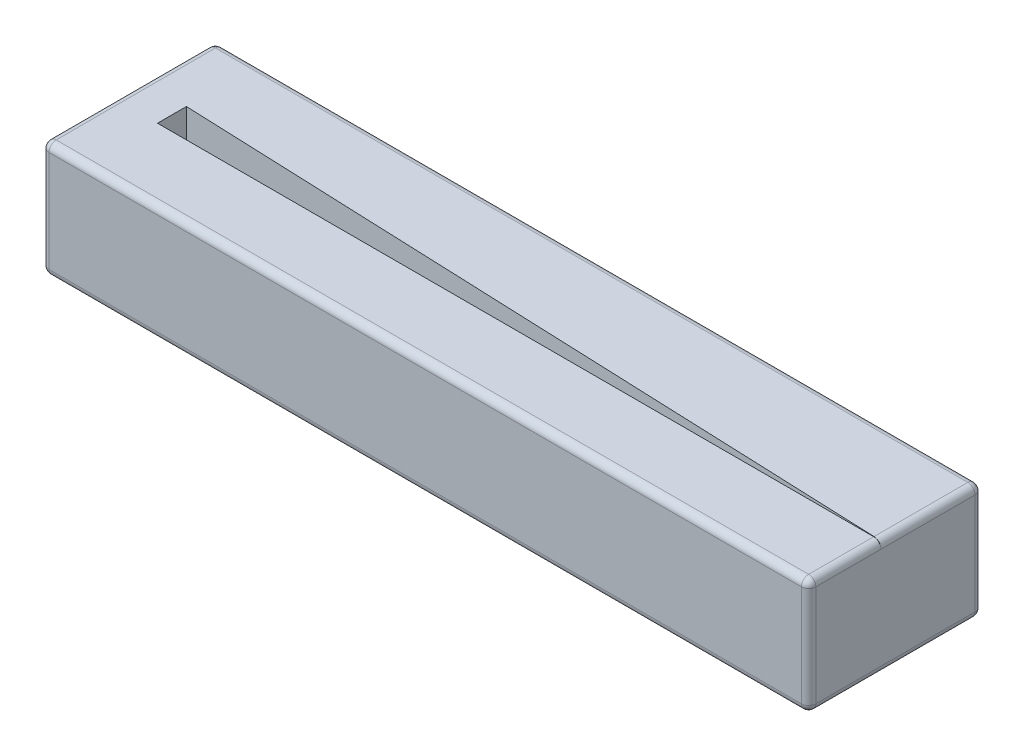
ISO-10303-21;
HEADER;
FILE_DESCRIPTION(('STEP AP214'),'2;1');
FILE_NAME('part.step','',(''),(''),'','','');
FILE_SCHEMA(('AUTOMOTIVE_DESIGN { 1 0 10303 214 1 1 1 1 }'));
ENDSEC;
DATA;
#1=APPLICATION_CONTEXT('core data for automotive mechanical design processes');
#2=APPLICATION_PROTOCOL_DEFINITION('international standard','automotive_design',2000,#1);
#3=PRODUCT_CONTEXT('',#1,'mechanical');
#4=PRODUCT('Part','Part','',(#3));
#5=PRODUCT_RELATED_PRODUCT_CATEGORY('part','',(#4));
#6=PRODUCT_DEFINITION_FORMATION('','',#4);
#7=PRODUCT_DEFINITION_CONTEXT('part definition',#1,'design');
#8=PRODUCT_DEFINITION('design','',#6,#7);
#9=PRODUCT_DEFINITION_SHAPE('','',#8);
#10=(LENGTH_UNIT() NAMED_UNIT(*) SI_UNIT(.MILLI.,.METRE.));
#11=(NAMED_UNIT(*) PLANE_ANGLE_UNIT() SI_UNIT($,.RADIAN.));
#12=(NAMED_UNIT(*) SI_UNIT($,.STERADIAN.) SOLID_ANGLE_UNIT());
#13=UNCERTAINTY_MEASURE_WITH_UNIT(LENGTH_MEASURE(1.E-05),#10,'distance_accuracy_value','');
#14=(GEOMETRIC_REPRESENTATION_CONTEXT(3) GLOBAL_UNCERTAINTY_ASSIGNED_CONTEXT((#13)) GLOBAL_UNIT_ASSIGNED_CONTEXT((#10,
#11,#12)) REPRESENTATION_CONTEXT('',''));
#15=CARTESIAN_POINT('',(0.,0.,0.));
#16=DIRECTION('',(0.,0.,1.));
#17=DIRECTION('',(1.,0.,0.));
#18=AXIS2_PLACEMENT_3D('',#15,#16,#17);
#19=CARTESIAN_POINT('',(0.,5.,6.));
#20=DIRECTION('',(1.,0.,0.));
#21=DIRECTION('',(0.,0.,-1.));
#22=AXIS2_PLACEMENT_3D('',#19,#20,#21);
#23=PLANE('',#22);
#24=DIRECTION('',(0.,-1.,0.));
#25=VECTOR('',#24,1.);
#26=CARTESIAN_POINT('',(0.,5.,0.999999999999997));
#27=LINE('',#26,#25);
#28=CARTESIAN_POINT('',(0.,5.,0.999999999999997));
#29=VERTEX_POINT('',#28);
#30=CARTESIAN_POINT('',(0.,0.,0.999999999999997));
#31=VERTEX_POINT('',#30);
#32=EDGE_CURVE('E199',#29,#31,#27,.T.);
#33=ORIENTED_EDGE('',*,*,#32,.T.);
#34=DIRECTION('',(0.,0.,-1.));
#35=VECTOR('',#34,1.);
#36=CARTESIAN_POINT('',(0.,0.,6.));
#37=LINE('',#36,#35);
#38=CARTESIAN_POINT('',(0.,0.,-1.));
#39=VERTEX_POINT('',#38);
#40=EDGE_CURVE('E187',#31,#39,#37,.T.);
#41=ORIENTED_EDGE('',*,*,#40,.T.);
#42=DIRECTION('',(0.,-1.,0.));
#43=VECTOR('',#42,1.);
#44=CARTESIAN_POINT('',(0.,5.,-1.));
#45=LINE('',#44,#43);
#46=CARTESIAN_POINT('',(0.,5.,-1.));
#47=VERTEX_POINT('',#46);
#48=EDGE_CURVE('E173',#47,#39,#45,.T.);
#49=ORIENTED_EDGE('',*,*,#48,.F.);
#50=DIRECTION('',(0.,0.,1.));
#51=VECTOR('',#50,1.);
#52=CARTESIAN_POINT('',(0.,5.,6.));
#53=LINE('',#52,#51);
#54=EDGE_CURVE('E194',#47,#29,#53,.T.);
#55=ORIENTED_EDGE('',*,*,#54,.T.);
#56=EDGE_LOOP('',(#33,#41,#49,#55));
#57=FACE_BOUND('',#56,.T.);
#58=ADVANCED_FACE('F43',(#57),#23,.T.);
#59=CARTESIAN_POINT('',(50.,5.,0.));
#60=DIRECTION('',(1.,0.,0.));
#61=DIRECTION('',(0.,0.,-1.));
#62=AXIS2_PLACEMENT_3D('',#59,#60,#61);
#63=PLANE('',#62);
#64=DIRECTION('',(0.,-1.,0.));
#65=VECTOR('',#64,1.);
#66=CARTESIAN_POINT('',(50.,5.,0.999999999999997));
#67=LINE('',#66,#65);
#68=CARTESIAN_POINT('',(50.,4.5,0.999999999999997));
#69=VERTEX_POINT('',#68);
#70=CARTESIAN_POINT('',(50.,0.,0.999999999999997));
#71=VERTEX_POINT('',#70);
#72=EDGE_CURVE('E203',#69,#71,#67,.T.);
#73=ORIENTED_EDGE('',*,*,#72,.F.);
#74=DIRECTION('',(0.,0.,1.));
#75=VECTOR('',#74,1.);
#76=CARTESIAN_POINT('',(50.,4.5,0.));
#77=LINE('',#76,#75);
#78=CARTESIAN_POINT('',(50.,4.5,5.5));
#79=VERTEX_POINT('',#78);
#80=EDGE_CURVE('E241',#69,#79,#77,.T.);
#81=ORIENTED_EDGE('',*,*,#80,.T.);
#82=DIRECTION('',(0.,-1.,0.));
#83=VECTOR('',#82,1.);
#84=CARTESIAN_POINT('',(50.,-3.,5.5));
#85=LINE('',#84,#83);
#86=CARTESIAN_POINT('',(50.,-2.5,5.5));
#87=VERTEX_POINT('',#86);
#88=EDGE_CURVE('E239',#79,#87,#85,.T.);
#89=ORIENTED_EDGE('',*,*,#88,.T.);
#90=DIRECTION('',(0.,0.,1.));
#91=VECTOR('',#90,1.);
#92=CARTESIAN_POINT('',(50.,-2.5,-6.));
#93=LINE('',#92,#91);
#94=CARTESIAN_POINT('',(50.,-2.5,-5.5));
#95=VERTEX_POINT('',#94);
#96=EDGE_CURVE('E237',#87,#95,#93,.F.);
#97=ORIENTED_EDGE('',*,*,#96,.T.);
#98=DIRECTION('',(0.,-1.,0.));
#99=VECTOR('',#98,1.);
#100=CARTESIAN_POINT('',(50.,5.,-5.5));
#101=LINE('',#100,#99);
#102=CARTESIAN_POINT('',(50.,4.5,-5.5));
#103=VERTEX_POINT('',#102);
#104=EDGE_CURVE('E235',#95,#103,#101,.F.);
#105=ORIENTED_EDGE('',*,*,#104,.T.);
#106=DIRECTION('',(0.,0.,1.));
#107=VECTOR('',#106,1.);
#108=CARTESIAN_POINT('',(50.,4.5,0.));
#109=LINE('',#108,#107);
#110=CARTESIAN_POINT('',(50.,4.5,0.998001998001992));
#111=VERTEX_POINT('',#110);
#112=EDGE_CURVE('E170',#103,#111,#109,.T.);
#113=ORIENTED_EDGE('',*,*,#112,.T.);
#114=DIRECTION('',(0.,-1.,0.));
#115=VECTOR('',#114,1.);
#116=CARTESIAN_POINT('',(50.,5.,0.998001998001992));
#117=LINE('',#116,#115);
#118=CARTESIAN_POINT('',(50.,0.,0.998001998001992));
#119=VERTEX_POINT('',#118);
#120=EDGE_CURVE('E163',#111,#119,#117,.T.);
#121=ORIENTED_EDGE('',*,*,#120,.T.);
#122=DIRECTION('',(0.,0.,1.));
#123=VECTOR('',#122,1.);
#124=CARTESIAN_POINT('',(50.,0.,6.));
#125=LINE('',#124,#123);
#126=EDGE_CURVE('E168',#119,#71,#125,.T.);
#127=ORIENTED_EDGE('',*,*,#126,.T.);
#128=EDGE_LOOP('',(#73,#81,#89,#97,#105,#113,#121,#127));
#129=FACE_BOUND('',#128,.T.);
#130=ADVANCED_FACE('F166',(#129),#63,.T.);
#131=CARTESIAN_POINT('',(0.,5.,1.));
#132=DIRECTION('',(0.,0.,1.));
#133=DIRECTION('',(1.,0.,0.));
#134=AXIS2_PLACEMENT_3D('',#131,#132,#133);
#135=PLANE('',#134);
#136=DIRECTION('',(-1.,0.,0.));
#137=VECTOR('',#136,1.);
#138=CARTESIAN_POINT('',(0.,5.,1.));
#139=LINE('',#138,#137);
#140=CARTESIAN_POINT('',(49.5,5.,0.999999999999994));
#141=VERTEX_POINT('',#140);
#142=EDGE_CURVE('E197',#141,#29,#139,.T.);
#143=ORIENTED_EDGE('',*,*,#142,.F.);
#144=CARTESIAN_POINT('',(49.5,4.5,0.999999999999994));
#145=DIRECTION('',(0.,0.,1.));
#146=DIRECTION('',(1.,0.,0.));
#147=AXIS2_PLACEMENT_3D('',#144,#145,#146);
#148=CIRCLE('',#147,0.5);
#149=EDGE_CURVE('E52',#141,#69,#148,.F.);
#150=ORIENTED_EDGE('',*,*,#149,.T.);
#151=ORIENTED_EDGE('',*,*,#72,.T.);
#152=DIRECTION('',(-1.,0.,0.));
#153=VECTOR('',#152,1.);
#154=CARTESIAN_POINT('',(0.,0.,1.));
#155=LINE('',#154,#153);
#156=EDGE_CURVE('E186',#71,#31,#155,.T.);
#157=ORIENTED_EDGE('',*,*,#156,.T.);
#158=ORIENTED_EDGE('',*,*,#32,.F.);
#159=EDGE_LOOP('',(#143,#150,#151,#157,#158));
#160=FACE_BOUND('',#159,.T.);
#161=ADVANCED_FACE('F366',(#160),#135,.F.);
#162=CARTESIAN_POINT('',(0.,5.,6.));
#163=DIRECTION('',(0.,0.,-1.));
#164=DIRECTION('',(-1.,0.,0.));
#165=AXIS2_PLACEMENT_3D('',#162,#163,#164);
#166=PLANE('',#165);
#167=DIRECTION('',(1.,0.,0.));
#168=VECTOR('',#167,1.);
#169=CARTESIAN_POINT('',(-3.,4.5,6.));
#170=LINE('',#169,#168);
#171=CARTESIAN_POINT('',(49.5,4.5,6.));
#172=VERTEX_POINT('',#171);
#173=CARTESIAN_POINT('',(-2.5,4.5,6.));
#174=VERTEX_POINT('',#173);
#175=EDGE_CURVE('E60',#172,#174,#170,.F.);
#176=ORIENTED_EDGE('',*,*,#175,.T.);
#177=DIRECTION('',(0.,-1.,0.));
#178=VECTOR('',#177,1.);
#179=CARTESIAN_POINT('',(-2.5,-3.,6.));
#180=LINE('',#179,#178);
#181=CARTESIAN_POINT('',(-2.5,-2.5,6.));
#182=VERTEX_POINT('',#181);
#183=EDGE_CURVE('E256',#174,#182,#180,.T.);
#184=ORIENTED_EDGE('',*,*,#183,.T.);
#185=DIRECTION('',(-1.,0.,0.));
#186=VECTOR('',#185,1.);
#187=CARTESIAN_POINT('',(0.,-2.5,6.));
#188=LINE('',#187,#186);
#189=CARTESIAN_POINT('',(49.5,-2.5,6.));
#190=VERTEX_POINT('',#189);
#191=EDGE_CURVE('E252',#182,#190,#188,.F.);
#192=ORIENTED_EDGE('',*,*,#191,.T.);
#193=DIRECTION('',(0.,-1.,0.));
#194=VECTOR('',#193,1.);
#195=CARTESIAN_POINT('',(49.5,5.,6.));
#196=LINE('',#195,#194);
#197=EDGE_CURVE('E65',#190,#172,#196,.F.);
#198=ORIENTED_EDGE('',*,*,#197,.T.);
#199=EDGE_LOOP('',(#176,#184,#192,#198));
#200=FACE_BOUND('',#199,.T.);
#201=ADVANCED_FACE('F342',(#200),#166,.F.);
#202=CARTESIAN_POINT('',(0.,5.,0.));
#203=DIRECTION('',(0.,1.,0.));
#204=DIRECTION('',(0.,0.,1.));
#205=AXIS2_PLACEMENT_3D('',#202,#203,#204);
#206=PLANE('',#205);
#207=DIRECTION('',(1.,0.,0.));
#208=VECTOR('',#207,1.);
#209=CARTESIAN_POINT('',(50.,5.,5.5));
#210=LINE('',#209,#208);
#211=CARTESIAN_POINT('',(-2.5,5.,5.5));
#212=VERTEX_POINT('',#211);
#213=CARTESIAN_POINT('',(49.5,5.,5.5));
#214=VERTEX_POINT('',#213);
#215=EDGE_CURVE('E216',#212,#214,#210,.T.);
#216=ORIENTED_EDGE('',*,*,#215,.T.);
#217=DIRECTION('',(0.,0.,1.));
#218=VECTOR('',#217,1.);
#219=CARTESIAN_POINT('',(49.5,5.,0.));
#220=LINE('',#219,#218);
#221=EDGE_CURVE('E223',#214,#141,#220,.F.);
#222=ORIENTED_EDGE('',*,*,#221,.T.);
#223=ORIENTED_EDGE('',*,*,#142,.T.);
#224=ORIENTED_EDGE('',*,*,#54,.F.);
#225=DIRECTION('',(0.999202552502205,0.,0.0399281739261619));
#226=VECTOR('',#225,1.);
#227=CARTESIAN_POINT('',(0.039896333303773,5.,-0.998405740926922));
#228=LINE('',#227,#226);
#229=CARTESIAN_POINT('',(49.5,5.,0.978021978021972));
#230=VERTEX_POINT('',#229);
#231=EDGE_CURVE('E174',#47,#230,#228,.T.);
#232=ORIENTED_EDGE('',*,*,#231,.T.);
#233=DIRECTION('',(0.,0.,1.));
#234=VECTOR('',#233,1.);
#235=CARTESIAN_POINT('',(49.5,5.,0.));
#236=LINE('',#235,#234);
#237=CARTESIAN_POINT('',(49.5,5.,-5.5));
#238=VERTEX_POINT('',#237);
#239=EDGE_CURVE('E221',#230,#238,#236,.F.);
#240=ORIENTED_EDGE('',*,*,#239,.T.);
#241=DIRECTION('',(1.,0.,0.));
#242=VECTOR('',#241,1.);
#243=CARTESIAN_POINT('',(0.,5.,-5.5));
#244=LINE('',#243,#242);
#245=CARTESIAN_POINT('',(-2.5,5.,-5.5));
#246=VERTEX_POINT('',#245);
#247=EDGE_CURVE('E218',#238,#246,#244,.F.);
#248=ORIENTED_EDGE('',*,*,#247,.T.);
#249=DIRECTION('',(0.,0.,-1.));
#250=VECTOR('',#249,1.);
#251=CARTESIAN_POINT('',(-2.5,5.,0.));
#252=LINE('',#251,#250);
#253=EDGE_CURVE('E214',#246,#212,#252,.F.);
#254=ORIENTED_EDGE('',*,*,#253,.T.);
#255=EDGE_LOOP('',(#216,#222,#223,#224,#232,#240,#248,#254));
#256=FACE_BOUND('',#255,.T.);
#257=ADVANCED_FACE('F370',(#256),#206,.T.);
#258=CARTESIAN_POINT('',(0.,5.,-6.));
#259=DIRECTION('',(0.,0.,-1.));
#260=DIRECTION('',(-1.,0.,0.));
#261=AXIS2_PLACEMENT_3D('',#258,#259,#260);
#262=PLANE('',#261);
#263=DIRECTION('',(0.,-1.,0.));
#264=VECTOR('',#263,1.);
#265=CARTESIAN_POINT('',(-2.5,5.,-6.));
#266=LINE('',#265,#264);
#267=CARTESIAN_POINT('',(-2.5,-2.5,-6.));
#268=VERTEX_POINT('',#267);
#269=CARTESIAN_POINT('',(-2.5,4.5,-6.));
#270=VERTEX_POINT('',#269);
#271=EDGE_CURVE('E209',#268,#270,#266,.F.);
#272=ORIENTED_EDGE('',*,*,#271,.T.);
#273=DIRECTION('',(1.,0.,0.));
#274=VECTOR('',#273,1.);
#275=CARTESIAN_POINT('',(0.,4.5,-6.));
#276=LINE('',#275,#274);
#277=CARTESIAN_POINT('',(49.5,4.5,-6.));
#278=VERTEX_POINT('',#277);
#279=EDGE_CURVE('E211',#270,#278,#276,.T.);
#280=ORIENTED_EDGE('',*,*,#279,.T.);
#281=DIRECTION('',(0.,-1.,0.));
#282=VECTOR('',#281,1.);
#283=CARTESIAN_POINT('',(49.5,5.,-6.));
#284=LINE('',#283,#282);
#285=CARTESIAN_POINT('',(49.5,-2.5,-6.));
#286=VERTEX_POINT('',#285);
#287=EDGE_CURVE('E207',#278,#286,#284,.T.);
#288=ORIENTED_EDGE('',*,*,#287,.T.);
#289=DIRECTION('',(1.,0.,0.));
#290=VECTOR('',#289,1.);
#291=CARTESIAN_POINT('',(-3.,-2.5,-6.));
#292=LINE('',#291,#290);
#293=EDGE_CURVE('E205',#286,#268,#292,.F.);
#294=ORIENTED_EDGE('',*,*,#293,.T.);
#295=EDGE_LOOP('',(#272,#280,#288,#294));
#296=FACE_BOUND('',#295,.T.);
#297=ADVANCED_FACE('F385',(#296),#262,.T.);
#298=CARTESIAN_POINT('',(-3.,5.,6.));
#299=DIRECTION('',(-1.,0.,0.));
#300=DIRECTION('',(0.,0.,1.));
#301=AXIS2_PLACEMENT_3D('',#298,#299,#300);
#302=PLANE('',#301);
#303=DIRECTION('',(0.,0.,-1.));
#304=VECTOR('',#303,1.);
#305=CARTESIAN_POINT('',(-3.,4.5,6.));
#306=LINE('',#305,#304);
#307=CARTESIAN_POINT('',(-3.,4.5,5.5));
#308=VERTEX_POINT('',#307);
#309=CARTESIAN_POINT('',(-3.,4.5,-5.5));
#310=VERTEX_POINT('',#309);
#311=EDGE_CURVE('E225',#308,#310,#306,.T.);
#312=ORIENTED_EDGE('',*,*,#311,.T.);
#313=DIRECTION('',(0.,-1.,0.));
#314=VECTOR('',#313,1.);
#315=CARTESIAN_POINT('',(-3.,5.,-5.5));
#316=LINE('',#315,#314);
#317=CARTESIAN_POINT('',(-3.,-2.5,-5.5));
#318=VERTEX_POINT('',#317);
#319=EDGE_CURVE('E231',#310,#318,#316,.T.);
#320=ORIENTED_EDGE('',*,*,#319,.T.);
#321=DIRECTION('',(0.,0.,-1.));
#322=VECTOR('',#321,1.);
#323=CARTESIAN_POINT('',(-3.,-2.5,6.));
#324=LINE('',#323,#322);
#325=CARTESIAN_POINT('',(-3.,-2.5,5.5));
#326=VERTEX_POINT('',#325);
#327=EDGE_CURVE('E229',#318,#326,#324,.F.);
#328=ORIENTED_EDGE('',*,*,#327,.T.);
#329=DIRECTION('',(0.,-1.,0.));
#330=VECTOR('',#329,1.);
#331=CARTESIAN_POINT('',(-3.,5.,5.5));
#332=LINE('',#331,#330);
#333=EDGE_CURVE('E227',#326,#308,#332,.F.);
#334=ORIENTED_EDGE('',*,*,#333,.T.);
#335=EDGE_LOOP('',(#312,#320,#328,#334));
#336=FACE_BOUND('',#335,.T.);
#337=ADVANCED_FACE('F381',(#336),#302,.T.);
#338=CARTESIAN_POINT('',(0.,-3.,0.));
#339=DIRECTION('',(0.,1.,0.));
#340=DIRECTION('',(0.,0.,1.));
#341=AXIS2_PLACEMENT_3D('',#338,#339,#340);
#342=PLANE('',#341);
#343=DIRECTION('',(0.,0.,-1.));
#344=VECTOR('',#343,1.);
#345=CARTESIAN_POINT('',(-2.5,-3.,-6.));
#346=LINE('',#345,#344);
#347=CARTESIAN_POINT('',(-2.5,-3.,5.5));
#348=VERTEX_POINT('',#347);
#349=CARTESIAN_POINT('',(-2.5,-3.,-5.5));
#350=VERTEX_POINT('',#349);
#351=EDGE_CURVE('E247',#348,#350,#346,.T.);
#352=ORIENTED_EDGE('',*,*,#351,.T.);
#353=DIRECTION('',(1.,0.,0.));
#354=VECTOR('',#353,1.);
#355=CARTESIAN_POINT('',(50.,-3.,-5.5));
#356=LINE('',#355,#354);
#357=CARTESIAN_POINT('',(49.5,-3.,-5.5));
#358=VERTEX_POINT('',#357);
#359=EDGE_CURVE('E250',#350,#358,#356,.T.);
#360=ORIENTED_EDGE('',*,*,#359,.T.);
#361=DIRECTION('',(0.,0.,1.));
#362=VECTOR('',#361,1.);
#363=CARTESIAN_POINT('',(49.5,-3.,6.));
#364=LINE('',#363,#362);
#365=CARTESIAN_POINT('',(49.5,-3.,5.5));
#366=VERTEX_POINT('',#365);
#367=EDGE_CURVE('E245',#358,#366,#364,.T.);
#368=ORIENTED_EDGE('',*,*,#367,.T.);
#369=DIRECTION('',(-1.,0.,0.));
#370=VECTOR('',#369,1.);
#371=CARTESIAN_POINT('',(0.,-3.,5.5));
#372=LINE('',#371,#370);
#373=EDGE_CURVE('E243',#366,#348,#372,.T.);
#374=ORIENTED_EDGE('',*,*,#373,.T.);
#375=EDGE_LOOP('',(#352,#360,#368,#374));
#376=FACE_BOUND('',#375,.T.);
#377=ADVANCED_FACE('F459',(#376),#342,.F.);
#378=CARTESIAN_POINT('',(0.039896333303773,5.,-0.998405740926922));
#379=DIRECTION('',(0.0399281739261619,0.,-0.999202552502205));
#380=DIRECTION('',(-0.999202552502205,0.,-0.0399281739261619));
#381=AXIS2_PLACEMENT_3D('',#378,#379,#380);
#382=PLANE('',#381);
#383=ORIENTED_EDGE('',*,*,#120,.F.);
#384=CARTESIAN_POINT('',(49.5,4.5,0.978021978021971));
#385=DIRECTION('',(0.0399281739261619,0.,-0.999202552502205));
#386=DIRECTION('',(0.999202552502205,0.,0.0399281739261619));
#387=AXIS2_PLACEMENT_3D('',#384,#385,#386);
#388=ELLIPSE('',#387,0.500399041963913,0.5);
#389=EDGE_CURVE('E11',#111,#230,#388,.F.);
#390=ORIENTED_EDGE('',*,*,#389,.T.);
#391=ORIENTED_EDGE('',*,*,#231,.F.);
#392=ORIENTED_EDGE('',*,*,#48,.T.);
#393=DIRECTION('',(0.999202552502205,0.,0.0399281739261619));
#394=VECTOR('',#393,1.);
#395=CARTESIAN_POINT('',(0.039896333303773,0.,-0.998405740926922));
#396=LINE('',#395,#394);
#397=EDGE_CURVE('E178',#39,#119,#396,.T.);
#398=ORIENTED_EDGE('',*,*,#397,.T.);
#399=EDGE_LOOP('',(#383,#390,#391,#392,#398));
#400=FACE_BOUND('',#399,.T.);
#401=ADVANCED_FACE('F179',(#400),#382,.F.);
#402=CARTESIAN_POINT('',(0.,0.,0.));
#403=DIRECTION('',(0.,-1.,0.));
#404=DIRECTION('',(0.,0.,-1.));
#405=AXIS2_PLACEMENT_3D('',#402,#403,#404);
#406=PLANE('',#405);
#407=ORIENTED_EDGE('',*,*,#40,.F.);
#408=ORIENTED_EDGE('',*,*,#156,.F.);
#409=ORIENTED_EDGE('',*,*,#126,.F.);
#410=ORIENTED_EDGE('',*,*,#397,.F.);
#411=EDGE_LOOP('',(#407,#408,#409,#410));
#412=FACE_BOUND('',#411,.T.);
#413=ADVANCED_FACE('F185',(#412),#406,.F.);
#414=CARTESIAN_POINT('',(0.,-2.5,5.5));
#415=DIRECTION('',(-1.,0.,0.));
#416=DIRECTION('',(0.,0.,1.));
#417=AXIS2_PLACEMENT_3D('',#414,#415,#416);
#418=CYLINDRICAL_SURFACE('',#417,0.5);
#419=CARTESIAN_POINT('',(49.5,-2.5,5.5));
#420=DIRECTION('',(1.,0.,0.));
#421=DIRECTION('',(0.,1.,0.));
#422=AXIS2_PLACEMENT_3D('',#419,#420,#421);
#423=CIRCLE('',#422,0.5);
#424=EDGE_CURVE('E314',#190,#366,#423,.T.);
#425=ORIENTED_EDGE('',*,*,#424,.F.);
#426=ORIENTED_EDGE('',*,*,#191,.F.);
#427=CARTESIAN_POINT('',(-2.5,-2.5,5.5));
#428=DIRECTION('',(-1.,0.,0.));
#429=DIRECTION('',(0.,0.,1.));
#430=AXIS2_PLACEMENT_3D('',#427,#428,#429);
#431=CIRCLE('',#430,0.5);
#432=EDGE_CURVE('E317',#348,#182,#431,.T.);
#433=ORIENTED_EDGE('',*,*,#432,.F.);
#434=ORIENTED_EDGE('',*,*,#373,.F.);
#435=EDGE_LOOP('',(#425,#426,#433,#434));
#436=FACE_BOUND('',#435,.T.);
#437=ADVANCED_FACE('F353',(#436),#418,.T.);
#438=CARTESIAN_POINT('',(49.5,4.5,0.));
#439=DIRECTION('',(0.,0.,1.));
#440=DIRECTION('',(1.,0.,0.));
#441=AXIS2_PLACEMENT_3D('',#438,#439,#440);
#442=CYLINDRICAL_SURFACE('',#441,0.5);
#443=ORIENTED_EDGE('',*,*,#149,.F.);
#444=ORIENTED_EDGE('',*,*,#221,.F.);
#445=CARTESIAN_POINT('',(49.5,4.5,5.5));
#446=DIRECTION('',(0.,0.,1.));
#447=DIRECTION('',(1.,0.,0.));
#448=AXIS2_PLACEMENT_3D('',#445,#446,#447);
#449=CIRCLE('',#448,0.5);
#450=EDGE_CURVE('E47',#79,#214,#449,.T.);
#451=ORIENTED_EDGE('',*,*,#450,.F.);
#452=ORIENTED_EDGE('',*,*,#80,.F.);
#453=EDGE_LOOP('',(#443,#444,#451,#452));
#454=FACE_BOUND('',#453,.T.);
#455=ADVANCED_FACE('F45',(#454),#442,.T.);
#456=CARTESIAN_POINT('',(49.5,5.,5.5));
#457=DIRECTION('',(0.,1.,0.));
#458=DIRECTION('',(0.,0.,1.));
#459=AXIS2_PLACEMENT_3D('',#456,#457,#458);
#460=CYLINDRICAL_SURFACE('',#459,0.5);
#461=CARTESIAN_POINT('',(49.5,-2.5,5.5));
#462=DIRECTION('',(0.,-1.,0.));
#463=DIRECTION('',(0.,0.,-1.));
#464=AXIS2_PLACEMENT_3D('',#461,#462,#463);
#465=CIRCLE('',#464,0.5);
#466=EDGE_CURVE('E311',#87,#190,#465,.T.);
#467=ORIENTED_EDGE('',*,*,#466,.F.);
#468=ORIENTED_EDGE('',*,*,#88,.F.);
#469=CARTESIAN_POINT('',(49.5,4.5,5.5));
#470=DIRECTION('',(0.,1.,0.));
#471=DIRECTION('',(0.,0.,1.));
#472=AXIS2_PLACEMENT_3D('',#469,#470,#471);
#473=CIRCLE('',#472,0.5);
#474=EDGE_CURVE('E319',#172,#79,#473,.T.);
#475=ORIENTED_EDGE('',*,*,#474,.F.);
#476=ORIENTED_EDGE('',*,*,#197,.F.);
#477=EDGE_LOOP('',(#467,#468,#475,#476));
#478=FACE_BOUND('',#477,.T.);
#479=ADVANCED_FACE('F349',(#478),#460,.T.);
#480=CARTESIAN_POINT('',(49.5,4.5,5.5));
#481=DIRECTION('',(1.,0.,0.));
#482=DIRECTION('',(0.,0.,-1.));
#483=AXIS2_PLACEMENT_3D('',#480,#481,#482);
#484=SPHERICAL_SURFACE('',#483,0.5);
#485=ORIENTED_EDGE('',*,*,#474,.T.);
#486=ORIENTED_EDGE('',*,*,#450,.T.);
#487=CARTESIAN_POINT('',(49.5,4.5,5.5));
#488=DIRECTION('',(1.,0.,0.));
#489=DIRECTION('',(0.,0.,-1.));
#490=AXIS2_PLACEMENT_3D('',#487,#488,#489);
#491=CIRCLE('',#490,0.5);
#492=EDGE_CURVE('E308',#172,#214,#491,.F.);
#493=ORIENTED_EDGE('',*,*,#492,.F.);
#494=EDGE_LOOP('',(#485,#486,#493));
#495=FACE_BOUND('',#494,.T.);
#496=ADVANCED_FACE('F325',(#495),#484,.T.);
#497=CARTESIAN_POINT('',(-2.5,-2.5,5.5));
#498=DIRECTION('',(0.,0.,1.));
#499=DIRECTION('',(1.,0.,0.));
#500=AXIS2_PLACEMENT_3D('',#497,#498,#499);
#501=SPHERICAL_SURFACE('',#500,0.5);
#502=CARTESIAN_POINT('',(-2.5,-2.5,5.5));
#503=DIRECTION('',(0.,0.,1.));
#504=DIRECTION('',(1.,0.,0.));
#505=AXIS2_PLACEMENT_3D('',#502,#503,#504);
#506=CIRCLE('',#505,0.5);
#507=EDGE_CURVE('E303',#348,#326,#506,.F.);
#508=ORIENTED_EDGE('',*,*,#507,.F.);
#509=ORIENTED_EDGE('',*,*,#432,.T.);
#510=CARTESIAN_POINT('',(-2.5,-2.5,5.5));
#511=DIRECTION('',(0.,-1.,0.));
#512=DIRECTION('',(0.,0.,-1.));
#513=AXIS2_PLACEMENT_3D('',#510,#511,#512);
#514=CIRCLE('',#513,0.5);
#515=EDGE_CURVE('E306',#326,#182,#514,.F.);
#516=ORIENTED_EDGE('',*,*,#515,.F.);
#517=EDGE_LOOP('',(#508,#509,#516));
#518=FACE_BOUND('',#517,.T.);
#519=ADVANCED_FACE('F444',(#518),#501,.T.);
#520=CARTESIAN_POINT('',(49.5,-2.5,5.5));
#521=DIRECTION('',(0.,0.,1.));
#522=DIRECTION('',(1.,0.,0.));
#523=AXIS2_PLACEMENT_3D('',#520,#521,#522);
#524=SPHERICAL_SURFACE('',#523,0.5);
#525=ORIENTED_EDGE('',*,*,#466,.T.);
#526=ORIENTED_EDGE('',*,*,#424,.T.);
#527=CARTESIAN_POINT('',(49.5,-2.5,5.5));
#528=DIRECTION('',(0.,0.,1.));
#529=DIRECTION('',(1.,0.,0.));
#530=AXIS2_PLACEMENT_3D('',#527,#528,#529);
#531=CIRCLE('',#530,0.5);
#532=EDGE_CURVE('E300',#87,#366,#531,.F.);
#533=ORIENTED_EDGE('',*,*,#532,.F.);
#534=EDGE_LOOP('',(#525,#526,#533));
#535=FACE_BOUND('',#534,.T.);
#536=ADVANCED_FACE('F355',(#535),#524,.T.);
#537=CARTESIAN_POINT('',(0.,4.5,5.5));
#538=DIRECTION('',(-1.,0.,0.));
#539=DIRECTION('',(0.,0.,1.));
#540=AXIS2_PLACEMENT_3D('',#537,#538,#539);
#541=CYLINDRICAL_SURFACE('',#540,0.5);
#542=ORIENTED_EDGE('',*,*,#492,.T.);
#543=ORIENTED_EDGE('',*,*,#215,.F.);
#544=CARTESIAN_POINT('',(-2.5,4.5,5.5));
#545=DIRECTION('',(-1.,0.,0.));
#546=DIRECTION('',(0.,0.,1.));
#547=AXIS2_PLACEMENT_3D('',#544,#545,#546);
#548=CIRCLE('',#547,0.5);
#549=EDGE_CURVE('E297',#174,#212,#548,.T.);
#550=ORIENTED_EDGE('',*,*,#549,.F.);
#551=ORIENTED_EDGE('',*,*,#175,.F.);
#552=EDGE_LOOP('',(#542,#543,#550,#551));
#553=FACE_BOUND('',#552,.T.);
#554=ADVANCED_FACE('F331',(#553),#541,.T.);
#555=CARTESIAN_POINT('',(-2.5,5.,5.5));
#556=DIRECTION('',(0.,1.,0.));
#557=DIRECTION('',(0.,0.,1.));
#558=AXIS2_PLACEMENT_3D('',#555,#556,#557);
#559=CYLINDRICAL_SURFACE('',#558,0.5);
#560=ORIENTED_EDGE('',*,*,#515,.T.);
#561=ORIENTED_EDGE('',*,*,#183,.F.);
#562=CARTESIAN_POINT('',(-2.5,4.5,5.5));
#563=DIRECTION('',(0.,1.,0.));
#564=DIRECTION('',(0.,0.,1.));
#565=AXIS2_PLACEMENT_3D('',#562,#563,#564);
#566=CIRCLE('',#565,0.5);
#567=EDGE_CURVE('E294',#308,#174,#566,.T.);
#568=ORIENTED_EDGE('',*,*,#567,.F.);
#569=ORIENTED_EDGE('',*,*,#333,.F.);
#570=EDGE_LOOP('',(#560,#561,#568,#569));
#571=FACE_BOUND('',#570,.T.);
#572=ADVANCED_FACE('F340',(#571),#559,.T.);
#573=CARTESIAN_POINT('',(-2.5,-2.5,0.));
#574=DIRECTION('',(0.,0.,1.));
#575=DIRECTION('',(1.,0.,0.));
#576=AXIS2_PLACEMENT_3D('',#573,#574,#575);
#577=CYLINDRICAL_SURFACE('',#576,0.5);
#578=ORIENTED_EDGE('',*,*,#507,.T.);
#579=ORIENTED_EDGE('',*,*,#327,.F.);
#580=CARTESIAN_POINT('',(-2.5,-2.5,-5.5));
#581=DIRECTION('',(0.,0.,-1.));
#582=DIRECTION('',(-1.,0.,0.));
#583=AXIS2_PLACEMENT_3D('',#580,#581,#582);
#584=CIRCLE('',#583,0.5);
#585=EDGE_CURVE('E291',#350,#318,#584,.T.);
#586=ORIENTED_EDGE('',*,*,#585,.F.);
#587=ORIENTED_EDGE('',*,*,#351,.F.);
#588=EDGE_LOOP('',(#578,#579,#586,#587));
#589=FACE_BOUND('',#588,.T.);
#590=ADVANCED_FACE('F433',(#589),#577,.T.);
#591=CARTESIAN_POINT('',(0.,-2.5,-5.5));
#592=DIRECTION('',(-1.,0.,0.));
#593=DIRECTION('',(0.,0.,1.));
#594=AXIS2_PLACEMENT_3D('',#591,#592,#593);
#595=CYLINDRICAL_SURFACE('',#594,0.5);
#596=CARTESIAN_POINT('',(49.5,-2.5,-5.5));
#597=DIRECTION('',(1.,0.,0.));
#598=DIRECTION('',(0.,0.,-1.));
#599=AXIS2_PLACEMENT_3D('',#596,#597,#598);
#600=CIRCLE('',#599,0.5);
#601=EDGE_CURVE('E286',#358,#286,#600,.T.);
#602=ORIENTED_EDGE('',*,*,#601,.F.);
#603=ORIENTED_EDGE('',*,*,#359,.F.);
#604=CARTESIAN_POINT('',(-2.5,-2.5,-5.5));
#605=DIRECTION('',(-1.,0.,0.));
#606=DIRECTION('',(0.,0.,1.));
#607=AXIS2_PLACEMENT_3D('',#604,#605,#606);
#608=CIRCLE('',#607,0.5);
#609=EDGE_CURVE('E289',#268,#350,#608,.T.);
#610=ORIENTED_EDGE('',*,*,#609,.F.);
#611=ORIENTED_EDGE('',*,*,#293,.F.);
#612=EDGE_LOOP('',(#602,#603,#610,#611));
#613=FACE_BOUND('',#612,.T.);
#614=ADVANCED_FACE('F430',(#613),#595,.T.);
#615=CARTESIAN_POINT('',(49.5,-2.5,0.));
#616=DIRECTION('',(0.,0.,-1.));
#617=DIRECTION('',(-1.,0.,0.));
#618=AXIS2_PLACEMENT_3D('',#615,#616,#617);
#619=CYLINDRICAL_SURFACE('',#618,0.5);
#620=ORIENTED_EDGE('',*,*,#532,.T.);
#621=ORIENTED_EDGE('',*,*,#367,.F.);
#622=CARTESIAN_POINT('',(49.5,-2.5,-5.5));
#623=DIRECTION('',(0.,0.,-1.));
#624=DIRECTION('',(-1.,0.,0.));
#625=AXIS2_PLACEMENT_3D('',#622,#623,#624);
#626=CIRCLE('',#625,0.5);
#627=EDGE_CURVE('E283',#95,#358,#626,.T.);
#628=ORIENTED_EDGE('',*,*,#627,.F.);
#629=ORIENTED_EDGE('',*,*,#96,.F.);
#630=EDGE_LOOP('',(#620,#621,#628,#629));
#631=FACE_BOUND('',#630,.T.);
#632=ADVANCED_FACE('F360',(#631),#619,.T.);
#633=CARTESIAN_POINT('',(-2.5,4.5,5.5));
#634=DIRECTION('',(0.,0.,1.));
#635=DIRECTION('',(1.,0.,0.));
#636=AXIS2_PLACEMENT_3D('',#633,#634,#635);
#637=SPHERICAL_SURFACE('',#636,0.5);
#638=ORIENTED_EDGE('',*,*,#567,.T.);
#639=ORIENTED_EDGE('',*,*,#549,.T.);
#640=CARTESIAN_POINT('',(-2.5,4.5,5.5));
#641=DIRECTION('',(0.,0.,1.));
#642=DIRECTION('',(1.,0.,0.));
#643=AXIS2_PLACEMENT_3D('',#640,#641,#642);
#644=CIRCLE('',#643,0.5);
#645=EDGE_CURVE('E280',#308,#212,#644,.F.);
#646=ORIENTED_EDGE('',*,*,#645,.F.);
#647=EDGE_LOOP('',(#638,#639,#646));
#648=FACE_BOUND('',#647,.T.);
#649=ADVANCED_FACE('F336',(#648),#637,.T.);
#650=CARTESIAN_POINT('',(-2.5,-2.5,-5.5));
#651=DIRECTION('',(0.,-1.,0.));
#652=DIRECTION('',(0.,0.,-1.));
#653=AXIS2_PLACEMENT_3D('',#650,#651,#652);
#654=SPHERICAL_SURFACE('',#653,0.5);
#655=ORIENTED_EDGE('',*,*,#609,.T.);
#656=ORIENTED_EDGE('',*,*,#585,.T.);
#657=CARTESIAN_POINT('',(-2.5,-2.5,-5.5));
#658=DIRECTION('',(0.,-1.,0.));
#659=DIRECTION('',(0.,0.,-1.));
#660=AXIS2_PLACEMENT_3D('',#657,#658,#659);
#661=CIRCLE('',#660,0.5);
#662=EDGE_CURVE('E278',#268,#318,#661,.F.);
#663=ORIENTED_EDGE('',*,*,#662,.F.);
#664=EDGE_LOOP('',(#655,#656,#663));
#665=FACE_BOUND('',#664,.T.);
#666=ADVANCED_FACE('F421',(#665),#654,.T.);
#667=CARTESIAN_POINT('',(49.5,-2.5,-5.5));
#668=DIRECTION('',(0.,-1.,0.));
#669=DIRECTION('',(0.,0.,-1.));
#670=AXIS2_PLACEMENT_3D('',#667,#668,#669);
#671=SPHERICAL_SURFACE('',#670,0.5);
#672=ORIENTED_EDGE('',*,*,#627,.T.);
#673=ORIENTED_EDGE('',*,*,#601,.T.);
#674=CARTESIAN_POINT('',(49.5,-2.5,-5.5));
#675=DIRECTION('',(0.,-1.,0.));
#676=DIRECTION('',(0.,0.,-1.));
#677=AXIS2_PLACEMENT_3D('',#674,#675,#676);
#678=CIRCLE('',#677,0.5);
#679=EDGE_CURVE('E275',#95,#286,#678,.F.);
#680=ORIENTED_EDGE('',*,*,#679,.F.);
#681=EDGE_LOOP('',(#672,#673,#680));
#682=FACE_BOUND('',#681,.T.);
#683=ADVANCED_FACE('F417',(#682),#671,.T.);
#684=CARTESIAN_POINT('',(-2.5,4.5,6.));
#685=DIRECTION('',(0.,0.,-1.));
#686=DIRECTION('',(-1.,0.,0.));
#687=AXIS2_PLACEMENT_3D('',#684,#685,#686);
#688=CYLINDRICAL_SURFACE('',#687,0.5);
#689=ORIENTED_EDGE('',*,*,#645,.T.);
#690=ORIENTED_EDGE('',*,*,#253,.F.);
#691=CARTESIAN_POINT('',(-2.5,4.5,-5.5));
#692=DIRECTION('',(0.,0.,-1.));
#693=DIRECTION('',(0.,1.,0.));
#694=AXIS2_PLACEMENT_3D('',#691,#692,#693);
#695=CIRCLE('',#694,0.5);
#696=EDGE_CURVE('E272',#310,#246,#695,.T.);
#697=ORIENTED_EDGE('',*,*,#696,.F.);
#698=ORIENTED_EDGE('',*,*,#311,.F.);
#699=EDGE_LOOP('',(#689,#690,#697,#698));
#700=FACE_BOUND('',#699,.T.);
#701=ADVANCED_FACE('F413',(#700),#688,.T.);
#702=CARTESIAN_POINT('',(-2.5,5.,-5.5));
#703=DIRECTION('',(0.,-1.,0.));
#704=DIRECTION('',(0.,0.,-1.));
#705=AXIS2_PLACEMENT_3D('',#702,#703,#704);
#706=CYLINDRICAL_SURFACE('',#705,0.5);
#707=ORIENTED_EDGE('',*,*,#662,.T.);
#708=ORIENTED_EDGE('',*,*,#319,.F.);
#709=CARTESIAN_POINT('',(-2.5,4.5,-5.5));
#710=DIRECTION('',(0.,1.,0.));
#711=DIRECTION('',(0.,0.,1.));
#712=AXIS2_PLACEMENT_3D('',#709,#710,#711);
#713=CIRCLE('',#712,0.5);
#714=EDGE_CURVE('E269',#270,#310,#713,.T.);
#715=ORIENTED_EDGE('',*,*,#714,.F.);
#716=ORIENTED_EDGE('',*,*,#271,.F.);
#717=EDGE_LOOP('',(#707,#708,#715,#716));
#718=FACE_BOUND('',#717,.T.);
#719=ADVANCED_FACE('F409',(#718),#706,.T.);
#720=CARTESIAN_POINT('',(49.5,5.,-5.5));
#721=DIRECTION('',(0.,-1.,0.));
#722=DIRECTION('',(0.,0.,-1.));
#723=AXIS2_PLACEMENT_3D('',#720,#721,#722);
#724=CYLINDRICAL_SURFACE('',#723,0.5);
#725=ORIENTED_EDGE('',*,*,#679,.T.);
#726=ORIENTED_EDGE('',*,*,#287,.F.);
#727=CARTESIAN_POINT('',(49.5,4.5,-5.5));
#728=DIRECTION('',(0.,1.,0.));
#729=DIRECTION('',(0.,0.,1.));
#730=AXIS2_PLACEMENT_3D('',#727,#728,#729);
#731=CIRCLE('',#730,0.5);
#732=EDGE_CURVE('E266',#103,#278,#731,.T.);
#733=ORIENTED_EDGE('',*,*,#732,.F.);
#734=ORIENTED_EDGE('',*,*,#104,.F.);
#735=EDGE_LOOP('',(#725,#726,#733,#734));
#736=FACE_BOUND('',#735,.T.);
#737=ADVANCED_FACE('F405',(#736),#724,.T.);
#738=CARTESIAN_POINT('',(49.5,4.5,0.));
#739=DIRECTION('',(0.,0.,1.));
#740=DIRECTION('',(1.,0.,0.));
#741=AXIS2_PLACEMENT_3D('',#738,#739,#740);
#742=CYLINDRICAL_SURFACE('',#741,0.5);
#743=ORIENTED_EDGE('',*,*,#389,.F.);
#744=ORIENTED_EDGE('',*,*,#112,.F.);
#745=CARTESIAN_POINT('',(49.5,4.5,-5.5));
#746=DIRECTION('',(0.,0.,-1.));
#747=DIRECTION('',(-1.,0.,0.));
#748=AXIS2_PLACEMENT_3D('',#745,#746,#747);
#749=CIRCLE('',#748,0.5);
#750=EDGE_CURVE('E263',#238,#103,#749,.T.);
#751=ORIENTED_EDGE('',*,*,#750,.F.);
#752=ORIENTED_EDGE('',*,*,#239,.F.);
#753=EDGE_LOOP('',(#743,#744,#751,#752));
#754=FACE_BOUND('',#753,.T.);
#755=ADVANCED_FACE('F401',(#754),#742,.T.);
#756=CARTESIAN_POINT('',(-2.5,4.5,-5.5));
#757=DIRECTION('',(-1.,0.,0.));
#758=DIRECTION('',(0.,0.,1.));
#759=AXIS2_PLACEMENT_3D('',#756,#757,#758);
#760=SPHERICAL_SURFACE('',#759,0.5);
#761=ORIENTED_EDGE('',*,*,#714,.T.);
#762=ORIENTED_EDGE('',*,*,#696,.T.);
#763=CARTESIAN_POINT('',(-2.5,4.5,-5.5));
#764=DIRECTION('',(-1.,0.,0.));
#765=DIRECTION('',(0.,0.,1.));
#766=AXIS2_PLACEMENT_3D('',#763,#764,#765);
#767=CIRCLE('',#766,0.5);
#768=EDGE_CURVE('E261',#270,#246,#767,.F.);
#769=ORIENTED_EDGE('',*,*,#768,.F.);
#770=EDGE_LOOP('',(#761,#762,#769));
#771=FACE_BOUND('',#770,.T.);
#772=ADVANCED_FACE('F397',(#771),#760,.T.);
#773=CARTESIAN_POINT('',(49.5,4.5,-5.5));
#774=DIRECTION('',(1.,0.,0.));
#775=DIRECTION('',(0.,0.,-1.));
#776=AXIS2_PLACEMENT_3D('',#773,#774,#775);
#777=SPHERICAL_SURFACE('',#776,0.5);
#778=ORIENTED_EDGE('',*,*,#750,.T.);
#779=ORIENTED_EDGE('',*,*,#732,.T.);
#780=CARTESIAN_POINT('',(49.5,4.5,-5.5));
#781=DIRECTION('',(1.,0.,0.));
#782=DIRECTION('',(0.,0.,-1.));
#783=AXIS2_PLACEMENT_3D('',#780,#781,#782);
#784=CIRCLE('',#783,0.5);
#785=EDGE_CURVE('E259',#238,#278,#784,.F.);
#786=ORIENTED_EDGE('',*,*,#785,.F.);
#787=EDGE_LOOP('',(#778,#779,#786));
#788=FACE_BOUND('',#787,.T.);
#789=ADVANCED_FACE('F393',(#788),#777,.T.);
#790=CARTESIAN_POINT('',(0.,4.5,-5.5));
#791=DIRECTION('',(1.,0.,0.));
#792=DIRECTION('',(0.,0.,-1.));
#793=AXIS2_PLACEMENT_3D('',#790,#791,#792);
#794=CYLINDRICAL_SURFACE('',#793,0.5);
#795=ORIENTED_EDGE('',*,*,#768,.T.);
#796=ORIENTED_EDGE('',*,*,#247,.F.);
#797=ORIENTED_EDGE('',*,*,#785,.T.);
#798=ORIENTED_EDGE('',*,*,#279,.F.);
#799=EDGE_LOOP('',(#795,#796,#797,#798));
#800=FACE_BOUND('',#799,.T.);
#801=ADVANCED_FACE('F390',(#800),#794,.T.);
#802=CLOSED_SHELL('',(#58,#130,#161,#201,#257,#297,#337,#377,#401,#413,#437,#455,#479,#496,#519,
#536,#554,#572,#590,#614,#632,#649,#666,#683,#701,#719,#737,#755,#772,#789,#801));
#803=MANIFOLD_SOLID_BREP('B2',#802);
#804=ADVANCED_BREP_SHAPE_REPRESENTATION('',(#18,#803),#14);
#805=SHAPE_DEFINITION_REPRESENTATION(#9,#804);
ENDSEC;
END-ISO-10303-21;
